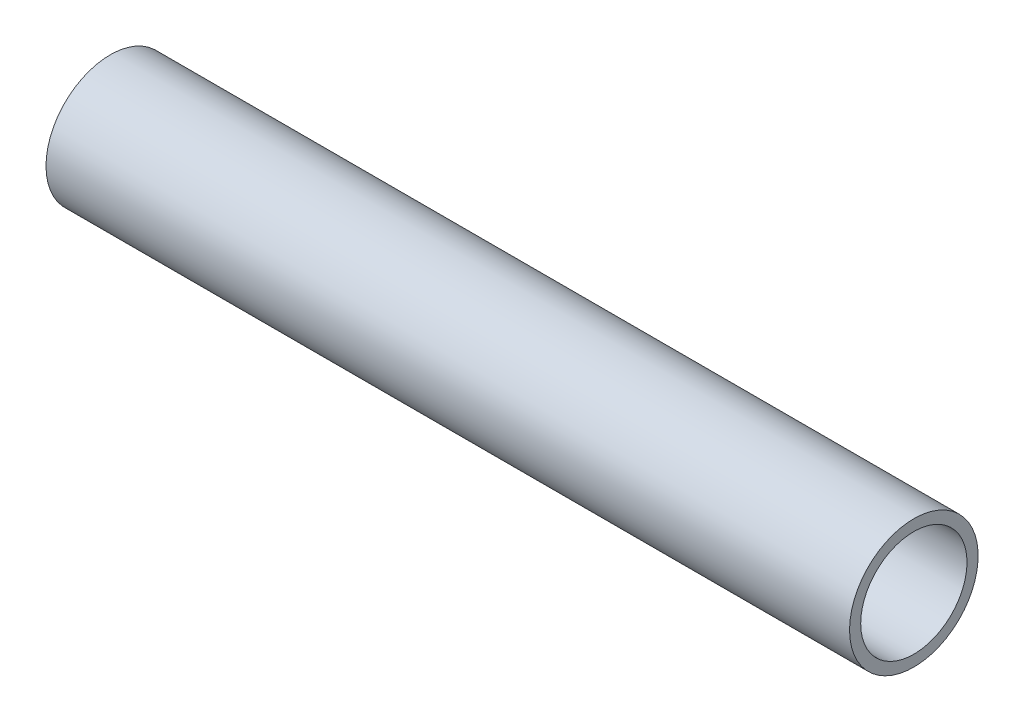
ISO-10303-21;
HEADER;
FILE_DESCRIPTION(('STEP AP214'),'2;1');
FILE_NAME('part.step','',(''),(''),'','','');
FILE_SCHEMA(('AUTOMOTIVE_DESIGN { 1 0 10303 214 1 1 1 1 }'));
ENDSEC;
DATA;
#1=APPLICATION_CONTEXT('core data for automotive mechanical design processes');
#2=APPLICATION_PROTOCOL_DEFINITION('international standard','automotive_design',2000,#1);
#3=PRODUCT_CONTEXT('',#1,'mechanical');
#4=PRODUCT('Part','Part','',(#3));
#5=PRODUCT_RELATED_PRODUCT_CATEGORY('part','',(#4));
#6=PRODUCT_DEFINITION_FORMATION('','',#4);
#7=PRODUCT_DEFINITION_CONTEXT('part definition',#1,'design');
#8=PRODUCT_DEFINITION('design','',#6,#7);
#9=PRODUCT_DEFINITION_SHAPE('','',#8);
#10=(LENGTH_UNIT() NAMED_UNIT(*) SI_UNIT(.MILLI.,.METRE.));
#11=(NAMED_UNIT(*) PLANE_ANGLE_UNIT() SI_UNIT($,.RADIAN.));
#12=(NAMED_UNIT(*) SI_UNIT($,.STERADIAN.) SOLID_ANGLE_UNIT());
#13=UNCERTAINTY_MEASURE_WITH_UNIT(LENGTH_MEASURE(1.E-05),#10,'distance_accuracy_value','');
#14=(GEOMETRIC_REPRESENTATION_CONTEXT(3) GLOBAL_UNCERTAINTY_ASSIGNED_CONTEXT((#13)) GLOBAL_UNIT_ASSIGNED_CONTEXT((#10,
#11,#12)) REPRESENTATION_CONTEXT('',''));
#15=CARTESIAN_POINT('',(0.,0.,0.));
#16=DIRECTION('',(0.,0.,1.));
#17=DIRECTION('',(1.,0.,0.));
#18=AXIS2_PLACEMENT_3D('',#15,#16,#17);
#19=CARTESIAN_POINT('',(317.5,0.,0.));
#20=DIRECTION('',(1.,0.,0.));
#21=DIRECTION('',(0.,0.,-1.));
#22=AXIS2_PLACEMENT_3D('',#19,#20,#21);
#23=PLANE('',#22);
#24=CARTESIAN_POINT('',(317.5,0.,0.));
#25=DIRECTION('',(1.,0.,0.));
#26=DIRECTION('',(0.,0.,-1.));
#27=AXIS2_PLACEMENT_3D('',#24,#25,#26);
#28=CIRCLE('',#27,50.8);
#29=CARTESIAN_POINT('',(317.5,0.,50.8));
#30=VERTEX_POINT('',#29);
#31=EDGE_CURVE('E10',#30,#30,#28,.T.);
#32=ORIENTED_EDGE('',*,*,#31,.T.);
#33=EDGE_LOOP('',(#32));
#34=FACE_BOUND('',#33,.T.);
#35=CARTESIAN_POINT('',(317.5,0.,0.));
#36=DIRECTION('',(1.,0.,0.));
#37=DIRECTION('',(0.,0.,-1.));
#38=AXIS2_PLACEMENT_3D('',#35,#36,#37);
#39=CIRCLE('',#38,42.);
#40=CARTESIAN_POINT('',(317.5,0.,42.));
#41=VERTEX_POINT('',#40);
#42=EDGE_CURVE('E41',#41,#41,#39,.T.);
#43=ORIENTED_EDGE('',*,*,#42,.F.);
#44=EDGE_LOOP('',(#43));
#45=FACE_BOUND('',#44,.T.);
#46=ADVANCED_FACE('F30',(#34,#45),#23,.T.);
#47=CARTESIAN_POINT('',(-317.5,0.,0.));
#48=DIRECTION('',(1.,0.,0.));
#49=DIRECTION('',(0.,0.,-1.));
#50=AXIS2_PLACEMENT_3D('',#47,#48,#49);
#51=PLANE('',#50);
#52=CARTESIAN_POINT('',(-317.5,0.,0.));
#53=DIRECTION('',(1.,0.,0.));
#54=DIRECTION('',(0.,0.,-1.));
#55=AXIS2_PLACEMENT_3D('',#52,#53,#54);
#56=CIRCLE('',#55,50.8);
#57=CARTESIAN_POINT('',(-317.5,0.,50.8));
#58=VERTEX_POINT('',#57);
#59=EDGE_CURVE('E34',#58,#58,#56,.T.);
#60=ORIENTED_EDGE('',*,*,#59,.F.);
#61=EDGE_LOOP('',(#60));
#62=FACE_BOUND('',#61,.T.);
#63=CARTESIAN_POINT('',(-317.5,0.,0.));
#64=DIRECTION('',(1.,0.,0.));
#65=DIRECTION('',(0.,0.,-1.));
#66=AXIS2_PLACEMENT_3D('',#63,#64,#65);
#67=CIRCLE('',#66,42.);
#68=CARTESIAN_POINT('',(-317.5,0.,42.));
#69=VERTEX_POINT('',#68);
#70=EDGE_CURVE('E43',#69,#69,#67,.T.);
#71=ORIENTED_EDGE('',*,*,#70,.T.);
#72=EDGE_LOOP('',(#71));
#73=FACE_BOUND('',#72,.T.);
#74=ADVANCED_FACE('F53',(#62,#73),#51,.F.);
#75=CARTESIAN_POINT('',(317.5,0.,0.));
#76=DIRECTION('',(-1.,0.,0.));
#77=DIRECTION('',(0.,0.,1.));
#78=AXIS2_PLACEMENT_3D('',#75,#76,#77);
#79=CYLINDRICAL_SURFACE('',#78,50.8);
#80=CARTESIAN_POINT('',(317.5,0.,50.8));
#81=CARTESIAN_POINT('',(310.885416666667,0.,50.8));
#82=CARTESIAN_POINT('',(304.270833333333,0.,50.8));
#83=CARTESIAN_POINT('',(291.041666666667,0.,50.8));
#84=CARTESIAN_POINT('',(284.427083333333,0.,50.8));
#85=CARTESIAN_POINT('',(271.197916666667,0.,50.8));
#86=CARTESIAN_POINT('',(264.583333333333,0.,50.8));
#87=CARTESIAN_POINT('',(251.354166666667,0.,50.8));
#88=CARTESIAN_POINT('',(244.739583333333,0.,50.8));
#89=CARTESIAN_POINT('',(231.510416666667,0.,50.8));
#90=CARTESIAN_POINT('',(224.895833333333,0.,50.8));
#91=CARTESIAN_POINT('',(211.666666666667,0.,50.8));
#92=CARTESIAN_POINT('',(205.052083333333,0.,50.8));
#93=CARTESIAN_POINT('',(191.822916666667,0.,50.8));
#94=CARTESIAN_POINT('',(185.208333333333,0.,50.8));
#95=CARTESIAN_POINT('',(171.979166666667,0.,50.8));
#96=CARTESIAN_POINT('',(165.364583333333,0.,50.8));
#97=CARTESIAN_POINT('',(152.135416666667,0.,50.8));
#98=CARTESIAN_POINT('',(145.520833333333,0.,50.8));
#99=CARTESIAN_POINT('',(132.291666666667,0.,50.8));
#100=CARTESIAN_POINT('',(125.677083333333,0.,50.8));
#101=CARTESIAN_POINT('',(112.447916666667,0.,50.8));
#102=CARTESIAN_POINT('',(105.833333333333,0.,50.8));
#103=CARTESIAN_POINT('',(92.6041666666667,0.,50.8));
#104=CARTESIAN_POINT('',(85.9895833333333,0.,50.8));
#105=CARTESIAN_POINT('',(72.7604166666667,0.,50.8));
#106=CARTESIAN_POINT('',(66.1458333333333,0.,50.8));
#107=CARTESIAN_POINT('',(52.9166666666667,0.,50.8));
#108=CARTESIAN_POINT('',(46.3020833333333,0.,50.8));
#109=CARTESIAN_POINT('',(33.0729166666667,0.,50.8));
#110=CARTESIAN_POINT('',(26.4583333333333,0.,50.8));
#111=CARTESIAN_POINT('',(13.2291666666667,0.,50.8));
#112=CARTESIAN_POINT('',(6.61458333333333,0.,50.8));
#113=CARTESIAN_POINT('',(-6.61458333333333,0.,50.8));
#114=CARTESIAN_POINT('',(-13.2291666666667,0.,50.8));
#115=CARTESIAN_POINT('',(-26.4583333333333,0.,50.8));
#116=CARTESIAN_POINT('',(-33.0729166666667,0.,50.8));
#117=CARTESIAN_POINT('',(-46.3020833333333,0.,50.8));
#118=CARTESIAN_POINT('',(-52.9166666666667,0.,50.8));
#119=CARTESIAN_POINT('',(-66.1458333333333,0.,50.8));
#120=CARTESIAN_POINT('',(-72.7604166666666,0.,50.8));
#121=CARTESIAN_POINT('',(-85.9895833333333,0.,50.8));
#122=CARTESIAN_POINT('',(-92.6041666666667,0.,50.8));
#123=CARTESIAN_POINT('',(-105.833333333333,0.,50.8));
#124=CARTESIAN_POINT('',(-112.447916666667,0.,50.8));
#125=CARTESIAN_POINT('',(-125.677083333333,0.,50.8));
#126=CARTESIAN_POINT('',(-132.291666666667,0.,50.8));
#127=CARTESIAN_POINT('',(-145.520833333333,0.,50.8));
#128=CARTESIAN_POINT('',(-152.135416666667,0.,50.8));
#129=CARTESIAN_POINT('',(-165.364583333333,0.,50.8));
#130=CARTESIAN_POINT('',(-171.979166666667,0.,50.8));
#131=CARTESIAN_POINT('',(-185.208333333333,0.,50.8));
#132=CARTESIAN_POINT('',(-191.822916666667,0.,50.8));
#133=CARTESIAN_POINT('',(-205.052083333333,0.,50.8));
#134=CARTESIAN_POINT('',(-211.666666666667,0.,50.8));
#135=CARTESIAN_POINT('',(-224.895833333333,0.,50.8));
#136=CARTESIAN_POINT('',(-231.510416666667,0.,50.8));
#137=CARTESIAN_POINT('',(-244.739583333333,0.,50.8));
#138=CARTESIAN_POINT('',(-251.354166666667,0.,50.8));
#139=CARTESIAN_POINT('',(-264.583333333333,0.,50.8));
#140=CARTESIAN_POINT('',(-271.197916666667,0.,50.8));
#141=CARTESIAN_POINT('',(-284.427083333333,0.,50.8));
#142=CARTESIAN_POINT('',(-291.041666666667,0.,50.8));
#143=CARTESIAN_POINT('',(-304.270833333333,0.,50.8));
#144=CARTESIAN_POINT('',(-310.885416666667,0.,50.8));
#145=CARTESIAN_POINT('',(-317.5,0.,50.8));
#146=B_SPLINE_CURVE_WITH_KNOTS('',3,(#80,#81,#82,#83,#84,#85,#86,#87,#88,#89,#90,#91,#92,#93,
#94,#95,#96,#97,#98,#99,#100,#101,#102,#103,#104,#105,#106,#107,#108,#109,#110,#111,#112,#113,
#114,#115,#116,#117,#118,#119,#120,#121,#122,#123,#124,#125,#126,#127,#128,#129,#130,#131,#132,
#133,#134,#135,#136,#137,#138,#139,#140,#141,#142,#143,#144,#145),.UNSPECIFIED.,.F.,.F.,(4,2,2,
2,2,2,2,2,2,2,2,2,2,2,2,2,2,2,2,2,2,2,2,2,2,2,2,2,2,2,2,2,4),(0.,19.84375,39.6875,59.53125,
79.375,99.21875,119.0625,138.90625,158.75,178.59375,198.4375,218.28125,238.125,257.96875,
277.8125,297.65625,317.5,337.34375,357.1875,377.03125,396.875,416.71875,436.5625,456.40625,
476.25,496.09375,515.9375,535.78125,555.625,575.46875,595.3125,615.15625,635.),.UNSPECIFIED.);
#147=EDGE_CURVE('BSEAM32',#30,#58,#146,.T.);
#148=ORIENTED_EDGE('',*,*,#31,.F.);
#149=ORIENTED_EDGE('',*,*,#59,.T.);
#150=ORIENTED_EDGE('',*,*,#147,.T.);
#151=ORIENTED_EDGE('',*,*,#147,.F.);
#152=EDGE_LOOP('',(#148,#150,#149,#151));
#153=FACE_BOUND('',#152,.T.);
#154=ADVANCED_FACE('F32',(#153),#79,.T.);
#155=CARTESIAN_POINT('',(317.5,0.,0.));
#156=DIRECTION('',(-1.,0.,0.));
#157=DIRECTION('',(0.,0.,1.));
#158=AXIS2_PLACEMENT_3D('',#155,#156,#157);
#159=CYLINDRICAL_SURFACE('',#158,42.);
#160=CARTESIAN_POINT('',(317.5,0.,42.));
#161=CARTESIAN_POINT('',(310.885416666667,0.,42.));
#162=CARTESIAN_POINT('',(304.270833333333,0.,42.));
#163=CARTESIAN_POINT('',(291.041666666667,0.,42.));
#164=CARTESIAN_POINT('',(284.427083333333,0.,42.));
#165=CARTESIAN_POINT('',(271.197916666667,0.,42.));
#166=CARTESIAN_POINT('',(264.583333333333,0.,42.));
#167=CARTESIAN_POINT('',(251.354166666667,0.,42.));
#168=CARTESIAN_POINT('',(244.739583333333,0.,42.));
#169=CARTESIAN_POINT('',(231.510416666667,0.,42.));
#170=CARTESIAN_POINT('',(224.895833333333,0.,42.));
#171=CARTESIAN_POINT('',(211.666666666667,0.,42.));
#172=CARTESIAN_POINT('',(205.052083333333,0.,42.));
#173=CARTESIAN_POINT('',(191.822916666667,0.,42.));
#174=CARTESIAN_POINT('',(185.208333333333,0.,42.));
#175=CARTESIAN_POINT('',(171.979166666667,0.,42.));
#176=CARTESIAN_POINT('',(165.364583333333,0.,42.));
#177=CARTESIAN_POINT('',(152.135416666667,0.,42.));
#178=CARTESIAN_POINT('',(145.520833333333,0.,42.));
#179=CARTESIAN_POINT('',(132.291666666667,0.,42.));
#180=CARTESIAN_POINT('',(125.677083333333,0.,42.));
#181=CARTESIAN_POINT('',(112.447916666667,0.,42.));
#182=CARTESIAN_POINT('',(105.833333333333,0.,42.));
#183=CARTESIAN_POINT('',(92.6041666666667,0.,42.));
#184=CARTESIAN_POINT('',(85.9895833333333,0.,42.));
#185=CARTESIAN_POINT('',(72.7604166666667,0.,42.));
#186=CARTESIAN_POINT('',(66.1458333333333,0.,42.));
#187=CARTESIAN_POINT('',(52.9166666666667,0.,42.));
#188=CARTESIAN_POINT('',(46.3020833333333,0.,42.));
#189=CARTESIAN_POINT('',(33.0729166666667,0.,42.));
#190=CARTESIAN_POINT('',(26.4583333333333,0.,42.));
#191=CARTESIAN_POINT('',(13.2291666666667,0.,42.));
#192=CARTESIAN_POINT('',(6.61458333333333,0.,42.));
#193=CARTESIAN_POINT('',(-6.61458333333333,0.,42.));
#194=CARTESIAN_POINT('',(-13.2291666666667,0.,42.));
#195=CARTESIAN_POINT('',(-26.4583333333333,0.,42.));
#196=CARTESIAN_POINT('',(-33.0729166666667,0.,42.));
#197=CARTESIAN_POINT('',(-46.3020833333333,0.,42.));
#198=CARTESIAN_POINT('',(-52.9166666666667,0.,42.));
#199=CARTESIAN_POINT('',(-66.1458333333333,0.,42.));
#200=CARTESIAN_POINT('',(-72.7604166666666,0.,42.));
#201=CARTESIAN_POINT('',(-85.9895833333333,0.,42.));
#202=CARTESIAN_POINT('',(-92.6041666666667,0.,42.));
#203=CARTESIAN_POINT('',(-105.833333333333,0.,42.));
#204=CARTESIAN_POINT('',(-112.447916666667,0.,42.));
#205=CARTESIAN_POINT('',(-125.677083333333,0.,42.));
#206=CARTESIAN_POINT('',(-132.291666666667,0.,42.));
#207=CARTESIAN_POINT('',(-145.520833333333,0.,42.));
#208=CARTESIAN_POINT('',(-152.135416666667,0.,42.));
#209=CARTESIAN_POINT('',(-165.364583333333,0.,42.));
#210=CARTESIAN_POINT('',(-171.979166666667,0.,42.));
#211=CARTESIAN_POINT('',(-185.208333333333,0.,42.));
#212=CARTESIAN_POINT('',(-191.822916666667,0.,42.));
#213=CARTESIAN_POINT('',(-205.052083333333,0.,42.));
#214=CARTESIAN_POINT('',(-211.666666666667,0.,42.));
#215=CARTESIAN_POINT('',(-224.895833333333,0.,42.));
#216=CARTESIAN_POINT('',(-231.510416666667,0.,42.));
#217=CARTESIAN_POINT('',(-244.739583333333,0.,42.));
#218=CARTESIAN_POINT('',(-251.354166666667,0.,42.));
#219=CARTESIAN_POINT('',(-264.583333333333,0.,42.));
#220=CARTESIAN_POINT('',(-271.197916666667,0.,42.));
#221=CARTESIAN_POINT('',(-284.427083333333,0.,42.));
#222=CARTESIAN_POINT('',(-291.041666666667,0.,42.));
#223=CARTESIAN_POINT('',(-304.270833333333,0.,42.));
#224=CARTESIAN_POINT('',(-310.885416666667,0.,42.));
#225=CARTESIAN_POINT('',(-317.5,0.,42.));
#226=B_SPLINE_CURVE_WITH_KNOTS('',3,(#160,#161,#162,#163,#164,#165,#166,#167,#168,#169,#170,
#171,#172,#173,#174,#175,#176,#177,#178,#179,#180,#181,#182,#183,#184,#185,#186,#187,#188,#189,
#190,#191,#192,#193,#194,#195,#196,#197,#198,#199,#200,#201,#202,#203,#204,#205,#206,#207,#208,
#209,#210,#211,#212,#213,#214,#215,#216,#217,#218,#219,#220,#221,#222,#223,#224,#225),
.UNSPECIFIED.,.F.,.F.,(4,2,2,2,2,2,2,2,2,2,2,2,2,2,2,2,2,2,2,2,2,2,2,2,2,2,2,2,2,2,2,2,4),(0.,
19.84375,39.6875,59.53125,79.375,99.21875,119.0625,138.90625,158.75,178.59375,198.4375,
218.28125,238.125,257.96875,277.8125,297.65625,317.5,337.34375,357.1875,377.03125,396.875,
416.71875,436.5625,456.40625,476.25,496.09375,515.9375,535.78125,555.625,575.46875,595.3125,
615.15625,635.),.UNSPECIFIED.);
#227=EDGE_CURVE('BSEAM49',#41,#69,#226,.T.);
#228=ORIENTED_EDGE('',*,*,#42,.T.);
#229=ORIENTED_EDGE('',*,*,#70,.F.);
#230=ORIENTED_EDGE('',*,*,#227,.T.);
#231=ORIENTED_EDGE('',*,*,#227,.F.);
#232=EDGE_LOOP('',(#228,#230,#229,#231));
#233=FACE_BOUND('',#232,.T.);
#234=ADVANCED_FACE('F49',(#233),#159,.F.);
#235=CLOSED_SHELL('',(#46,#74,#154,#234));
#236=MANIFOLD_SOLID_BREP('B2',#235);
#237=ADVANCED_BREP_SHAPE_REPRESENTATION('',(#18,#236),#14);
#238=SHAPE_DEFINITION_REPRESENTATION(#9,#237);
ENDSEC;
END-ISO-10303-21;
